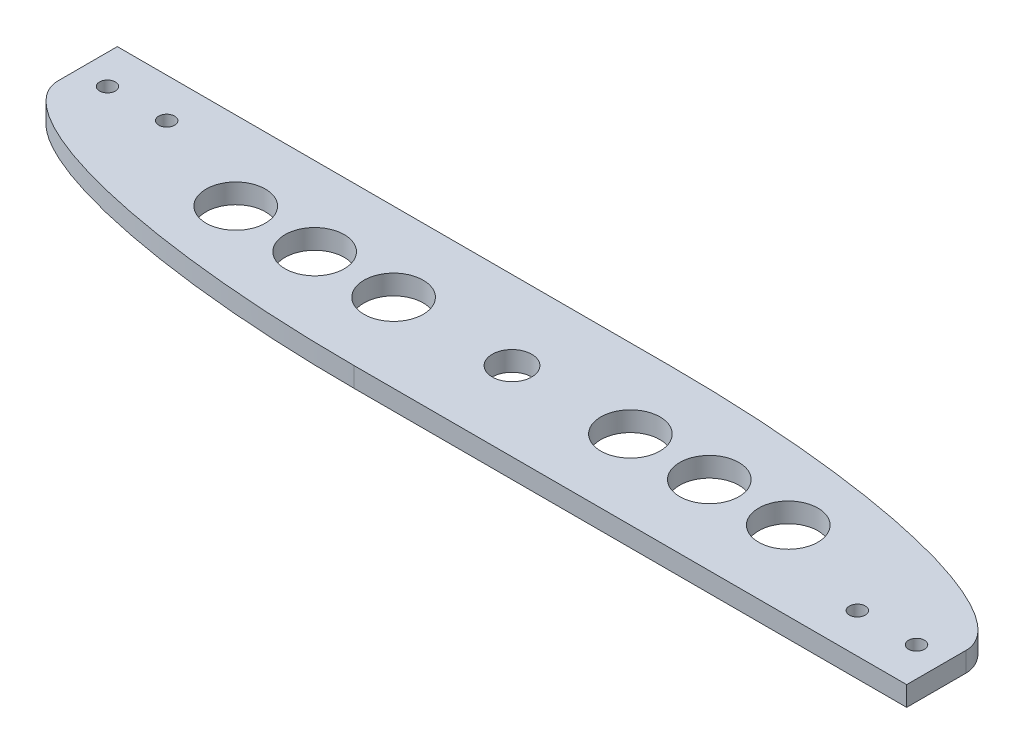
ISO-10303-21;
HEADER;
FILE_DESCRIPTION(('STEP AP214'),'2;1');
FILE_NAME('part.step','',(''),(''),'','','');
FILE_SCHEMA(('AUTOMOTIVE_DESIGN { 1 0 10303 214 1 1 1 1 }'));
ENDSEC;
DATA;
#1=APPLICATION_CONTEXT('core data for automotive mechanical design processes');
#2=APPLICATION_PROTOCOL_DEFINITION('international standard','automotive_design',2000,#1);
#3=PRODUCT_CONTEXT('',#1,'mechanical');
#4=PRODUCT('Part','Part','',(#3));
#5=PRODUCT_RELATED_PRODUCT_CATEGORY('part','',(#4));
#6=PRODUCT_DEFINITION_FORMATION('','',#4);
#7=PRODUCT_DEFINITION_CONTEXT('part definition',#1,'design');
#8=PRODUCT_DEFINITION('design','',#6,#7);
#9=PRODUCT_DEFINITION_SHAPE('','',#8);
#10=(LENGTH_UNIT() NAMED_UNIT(*) SI_UNIT(.MILLI.,.METRE.));
#11=(NAMED_UNIT(*) PLANE_ANGLE_UNIT() SI_UNIT($,.RADIAN.));
#12=(NAMED_UNIT(*) SI_UNIT($,.STERADIAN.) SOLID_ANGLE_UNIT());
#13=UNCERTAINTY_MEASURE_WITH_UNIT(LENGTH_MEASURE(1.E-05),#10,'distance_accuracy_value','');
#14=(GEOMETRIC_REPRESENTATION_CONTEXT(3) GLOBAL_UNCERTAINTY_ASSIGNED_CONTEXT((#13)) GLOBAL_UNIT_ASSIGNED_CONTEXT((#10,
#11,#12)) REPRESENTATION_CONTEXT('',''));
#15=CARTESIAN_POINT('',(0.,0.,0.));
#16=DIRECTION('',(0.,0.,1.));
#17=DIRECTION('',(1.,0.,0.));
#18=AXIS2_PLACEMENT_3D('',#15,#16,#17);
#19=CARTESIAN_POINT('',(0.,3.175,0.));
#20=DIRECTION('',(0.,-1.,0.));
#21=DIRECTION('',(0.,0.,-1.));
#22=AXIS2_PLACEMENT_3D('',#19,#20,#21);
#23=PLANE('',#22);
#24=DIRECTION('',(0.,0.,-1.));
#25=VECTOR('',#24,1.);
#26=CARTESIAN_POINT('',(152.4,3.175,25.4));
#27=LINE('',#26,#25);
#28=CARTESIAN_POINT('',(152.4,3.175,25.4));
#29=VERTEX_POINT('',#28);
#30=CARTESIAN_POINT('',(152.4,3.175,6.35));
#31=VERTEX_POINT('',#30);
#32=EDGE_CURVE('E116',#29,#31,#27,.T.);
#33=ORIENTED_EDGE('',*,*,#32,.T.);
#34=CARTESIAN_POINT('',(25.4,3.175,-25.4));
#35=CARTESIAN_POINT('',(152.4,3.175,-25.4));
#36=CARTESIAN_POINT('',(152.4,3.175,6.35));
#37=(BOUNDED_CURVE() B_SPLINE_CURVE(2,(#34,#35,#36),.UNSPECIFIED.,.F.,
.F.) B_SPLINE_CURVE_WITH_KNOTS((3,3),(0.,1.),
.UNSPECIFIED.) CURVE() GEOMETRIC_REPRESENTATION_ITEM() RATIONAL_B_SPLINE_CURVE((1.,
0.707106781186548,1.)) REPRESENTATION_ITEM(''));
#38=CARTESIAN_POINT('',(25.3999999999999,3.175,-25.4));
#39=VERTEX_POINT('',#38);
#40=EDGE_CURVE('E110',#31,#39,#37,.F.);
#41=ORIENTED_EDGE('',*,*,#40,.T.);
#42=DIRECTION('',(-1.,0.,0.));
#43=VECTOR('',#42,1.);
#44=CARTESIAN_POINT('',(-152.4,3.175,-25.4));
#45=LINE('',#44,#43);
#46=CARTESIAN_POINT('',(-152.4,3.175,-25.4));
#47=VERTEX_POINT('',#46);
#48=EDGE_CURVE('E104',#39,#47,#45,.T.);
#49=ORIENTED_EDGE('',*,*,#48,.T.);
#50=DIRECTION('',(0.,0.,1.));
#51=VECTOR('',#50,1.);
#52=CARTESIAN_POINT('',(-152.4,3.175,25.4));
#53=LINE('',#52,#51);
#54=CARTESIAN_POINT('',(-152.4,3.175,-6.35));
#55=VERTEX_POINT('',#54);
#56=EDGE_CURVE('E108',#47,#55,#53,.T.);
#57=ORIENTED_EDGE('',*,*,#56,.T.);
#58=CARTESIAN_POINT('',(-25.4,3.175,25.4));
#59=CARTESIAN_POINT('',(-152.4,3.175,25.4));
#60=CARTESIAN_POINT('',(-152.4,3.175,-6.35));
#61=(BOUNDED_CURVE() B_SPLINE_CURVE(2,(#58,#59,#60),.UNSPECIFIED.,.F.,
.F.) B_SPLINE_CURVE_WITH_KNOTS((3,3),(0.,1.),
.UNSPECIFIED.) CURVE() GEOMETRIC_REPRESENTATION_ITEM() RATIONAL_B_SPLINE_CURVE((1.,
0.707106781186548,1.)) REPRESENTATION_ITEM(''));
#62=CARTESIAN_POINT('',(-25.4000000000001,3.175,25.4));
#63=VERTEX_POINT('',#62);
#64=EDGE_CURVE('E66',#55,#63,#61,.F.);
#65=ORIENTED_EDGE('',*,*,#64,.T.);
#66=DIRECTION('',(1.,0.,0.));
#67=VECTOR('',#66,1.);
#68=CARTESIAN_POINT('',(-152.4,3.175,25.4));
#69=LINE('',#68,#67);
#70=EDGE_CURVE('E130',#63,#29,#69,.T.);
#71=ORIENTED_EDGE('',*,*,#70,.T.);
#72=EDGE_LOOP('',(#33,#41,#49,#57,#65,#71));
#73=FACE_BOUND('',#72,.T.);
#74=CARTESIAN_POINT('',(0.,3.175,0.));
#75=DIRECTION('',(0.,1.,0.));
#76=DIRECTION('',(0.,0.,1.));
#77=AXIS2_PLACEMENT_3D('',#74,#75,#76);
#78=CIRCLE('',#77,6.35);
#79=CARTESIAN_POINT('',(0.,3.175,6.35));
#80=VERTEX_POINT('',#79);
#81=EDGE_CURVE('E157',#80,#80,#78,.T.);
#82=ORIENTED_EDGE('',*,*,#81,.F.);
#83=EDGE_LOOP('',(#82));
#84=FACE_BOUND('',#83,.T.);
#85=CARTESIAN_POINT('',(-38.1,3.175,0.));
#86=DIRECTION('',(0.,1.,0.));
#87=DIRECTION('',(0.,0.,1.));
#88=AXIS2_PLACEMENT_3D('',#85,#86,#87);
#89=CIRCLE('',#88,9.525);
#90=CARTESIAN_POINT('',(-38.1,3.175,9.525));
#91=VERTEX_POINT('',#90);
#92=EDGE_CURVE('E195',#91,#91,#89,.T.);
#93=ORIENTED_EDGE('',*,*,#92,.F.);
#94=EDGE_LOOP('',(#93));
#95=FACE_BOUND('',#94,.T.);
#96=CARTESIAN_POINT('',(-63.5,3.175,0.));
#97=DIRECTION('',(0.,1.,0.));
#98=DIRECTION('',(0.,0.,1.));
#99=AXIS2_PLACEMENT_3D('',#96,#97,#98);
#100=CIRCLE('',#99,9.52500000000001);
#101=CARTESIAN_POINT('',(-63.5,3.175,9.52500000000001));
#102=VERTEX_POINT('',#101);
#103=EDGE_CURVE('E203',#102,#102,#100,.T.);
#104=ORIENTED_EDGE('',*,*,#103,.F.);
#105=EDGE_LOOP('',(#104));
#106=FACE_BOUND('',#105,.T.);
#107=CARTESIAN_POINT('',(-88.9,3.175,0.));
#108=DIRECTION('',(0.,1.,0.));
#109=DIRECTION('',(0.,0.,1.));
#110=AXIS2_PLACEMENT_3D('',#107,#108,#109);
#111=CIRCLE('',#110,9.52500000000001);
#112=CARTESIAN_POINT('',(-88.9,3.175,9.52500000000001));
#113=VERTEX_POINT('',#112);
#114=EDGE_CURVE('E211',#113,#113,#111,.T.);
#115=ORIENTED_EDGE('',*,*,#114,.F.);
#116=EDGE_LOOP('',(#115));
#117=FACE_BOUND('',#116,.T.);
#118=CARTESIAN_POINT('',(38.1,3.175,0.));
#119=DIRECTION('',(0.,1.,0.));
#120=DIRECTION('',(0.,0.,-1.));
#121=AXIS2_PLACEMENT_3D('',#118,#119,#120);
#122=CIRCLE('',#121,9.525);
#123=CARTESIAN_POINT('',(38.1,3.175,-9.525));
#124=VERTEX_POINT('',#123);
#125=EDGE_CURVE('E219',#124,#124,#122,.T.);
#126=ORIENTED_EDGE('',*,*,#125,.F.);
#127=EDGE_LOOP('',(#126));
#128=FACE_BOUND('',#127,.T.);
#129=CARTESIAN_POINT('',(63.5,3.175,0.));
#130=DIRECTION('',(0.,1.,0.));
#131=DIRECTION('',(0.,0.,-1.));
#132=AXIS2_PLACEMENT_3D('',#129,#130,#131);
#133=CIRCLE('',#132,9.52500000000001);
#134=CARTESIAN_POINT('',(63.5,3.175,-9.52500000000001));
#135=VERTEX_POINT('',#134);
#136=EDGE_CURVE('E227',#135,#135,#133,.T.);
#137=ORIENTED_EDGE('',*,*,#136,.F.);
#138=EDGE_LOOP('',(#137));
#139=FACE_BOUND('',#138,.T.);
#140=CARTESIAN_POINT('',(88.9,3.175,0.));
#141=DIRECTION('',(0.,1.,0.));
#142=DIRECTION('',(0.,0.,-1.));
#143=AXIS2_PLACEMENT_3D('',#140,#141,#142);
#144=CIRCLE('',#143,9.52500000000001);
#145=CARTESIAN_POINT('',(88.9,3.175,-9.52500000000001));
#146=VERTEX_POINT('',#145);
#147=EDGE_CURVE('E235',#146,#146,#144,.T.);
#148=ORIENTED_EDGE('',*,*,#147,.F.);
#149=EDGE_LOOP('',(#148));
#150=FACE_BOUND('',#149,.T.);
#151=CARTESIAN_POINT('',(142.875,3.175,12.7));
#152=DIRECTION('',(0.,1.,0.));
#153=DIRECTION('',(0.,0.,1.));
#154=AXIS2_PLACEMENT_3D('',#151,#152,#153);
#155=CIRCLE('',#154,2.55269999999998);
#156=CARTESIAN_POINT('',(142.875,3.175,15.2527));
#157=VERTEX_POINT('',#156);
#158=EDGE_CURVE('E243',#157,#157,#155,.T.);
#159=ORIENTED_EDGE('',*,*,#158,.F.);
#160=EDGE_LOOP('',(#159));
#161=FACE_BOUND('',#160,.T.);
#162=CARTESIAN_POINT('',(123.825,3.175,12.7));
#163=DIRECTION('',(0.,1.,0.));
#164=DIRECTION('',(0.,0.,1.));
#165=AXIS2_PLACEMENT_3D('',#162,#163,#164);
#166=CIRCLE('',#165,2.55269999999997);
#167=CARTESIAN_POINT('',(123.825,3.175,15.2527));
#168=VERTEX_POINT('',#167);
#169=EDGE_CURVE('E251',#168,#168,#166,.T.);
#170=ORIENTED_EDGE('',*,*,#169,.F.);
#171=EDGE_LOOP('',(#170));
#172=FACE_BOUND('',#171,.T.);
#173=CARTESIAN_POINT('',(-142.875,3.175,-12.7));
#174=DIRECTION('',(0.,1.,0.));
#175=DIRECTION('',(0.,0.,1.));
#176=AXIS2_PLACEMENT_3D('',#173,#174,#175);
#177=CIRCLE('',#176,2.55269999999998);
#178=CARTESIAN_POINT('',(-142.875,3.175,-10.1473));
#179=VERTEX_POINT('',#178);
#180=EDGE_CURVE('E259',#179,#179,#177,.T.);
#181=ORIENTED_EDGE('',*,*,#180,.F.);
#182=EDGE_LOOP('',(#181));
#183=FACE_BOUND('',#182,.T.);
#184=CARTESIAN_POINT('',(-123.825,3.175,-12.7));
#185=DIRECTION('',(0.,1.,0.));
#186=DIRECTION('',(0.,0.,1.));
#187=AXIS2_PLACEMENT_3D('',#184,#185,#186);
#188=CIRCLE('',#187,2.55270000000001);
#189=CARTESIAN_POINT('',(-123.825,3.175,-10.1473));
#190=VERTEX_POINT('',#189);
#191=EDGE_CURVE('E267',#190,#190,#188,.T.);
#192=ORIENTED_EDGE('',*,*,#191,.F.);
#193=EDGE_LOOP('',(#192));
#194=FACE_BOUND('',#193,.T.);
#195=ADVANCED_FACE('F44',(#73,#84,#95,#106,#117,#128,#139,#150,#161,#172,#183,#194),#23,.F.);
#196=CARTESIAN_POINT('',(0.,-3.175,0.));
#197=DIRECTION('',(0.,-1.,0.));
#198=DIRECTION('',(0.,0.,-1.));
#199=AXIS2_PLACEMENT_3D('',#196,#197,#198);
#200=PLANE('',#199);
#201=CARTESIAN_POINT('',(-142.875,-3.175,-12.7));
#202=DIRECTION('',(0.,1.,0.));
#203=DIRECTION('',(0.,0.,1.));
#204=AXIS2_PLACEMENT_3D('',#201,#202,#203);
#205=CIRCLE('',#204,2.55269999999998);
#206=CARTESIAN_POINT('',(-142.875,-3.175,-10.1473));
#207=VERTEX_POINT('',#206);
#208=EDGE_CURVE('E263',#207,#207,#205,.T.);
#209=ORIENTED_EDGE('',*,*,#208,.T.);
#210=EDGE_LOOP('',(#209));
#211=FACE_BOUND('',#210,.T.);
#212=CARTESIAN_POINT('',(142.875,-3.175,12.7));
#213=DIRECTION('',(0.,1.,0.));
#214=DIRECTION('',(0.,0.,1.));
#215=AXIS2_PLACEMENT_3D('',#212,#213,#214);
#216=CIRCLE('',#215,2.55269999999998);
#217=CARTESIAN_POINT('',(142.875,-3.175,15.2527));
#218=VERTEX_POINT('',#217);
#219=EDGE_CURVE('E247',#218,#218,#216,.T.);
#220=ORIENTED_EDGE('',*,*,#219,.T.);
#221=EDGE_LOOP('',(#220));
#222=FACE_BOUND('',#221,.T.);
#223=CARTESIAN_POINT('',(63.5,-3.175,0.));
#224=DIRECTION('',(0.,1.,0.));
#225=DIRECTION('',(0.,0.,-1.));
#226=AXIS2_PLACEMENT_3D('',#223,#224,#225);
#227=CIRCLE('',#226,9.52500000000001);
#228=CARTESIAN_POINT('',(63.5,-3.175,-9.52500000000001));
#229=VERTEX_POINT('',#228);
#230=EDGE_CURVE('E231',#229,#229,#227,.T.);
#231=ORIENTED_EDGE('',*,*,#230,.T.);
#232=EDGE_LOOP('',(#231));
#233=FACE_BOUND('',#232,.T.);
#234=CARTESIAN_POINT('',(-88.9,-3.175,0.));
#235=DIRECTION('',(0.,1.,0.));
#236=DIRECTION('',(0.,0.,1.));
#237=AXIS2_PLACEMENT_3D('',#234,#235,#236);
#238=CIRCLE('',#237,9.52500000000001);
#239=CARTESIAN_POINT('',(-88.9,-3.175,9.52500000000001));
#240=VERTEX_POINT('',#239);
#241=EDGE_CURVE('E215',#240,#240,#238,.T.);
#242=ORIENTED_EDGE('',*,*,#241,.T.);
#243=EDGE_LOOP('',(#242));
#244=FACE_BOUND('',#243,.T.);
#245=CARTESIAN_POINT('',(-38.1,-3.175,0.));
#246=DIRECTION('',(0.,1.,0.));
#247=DIRECTION('',(0.,0.,1.));
#248=AXIS2_PLACEMENT_3D('',#245,#246,#247);
#249=CIRCLE('',#248,9.525);
#250=CARTESIAN_POINT('',(-38.1,-3.175,9.525));
#251=VERTEX_POINT('',#250);
#252=EDGE_CURVE('E199',#251,#251,#249,.T.);
#253=ORIENTED_EDGE('',*,*,#252,.T.);
#254=EDGE_LOOP('',(#253));
#255=FACE_BOUND('',#254,.T.);
#256=DIRECTION('',(-1.,0.,0.));
#257=VECTOR('',#256,1.);
#258=CARTESIAN_POINT('',(-152.4,-3.175,-25.4));
#259=LINE('',#258,#257);
#260=CARTESIAN_POINT('',(25.3999999999999,-3.175,-25.4));
#261=VERTEX_POINT('',#260);
#262=CARTESIAN_POINT('',(-152.4,-3.175,-25.4));
#263=VERTEX_POINT('',#262);
#264=EDGE_CURVE('E122',#261,#263,#259,.T.);
#265=ORIENTED_EDGE('',*,*,#264,.F.);
#266=CARTESIAN_POINT('',(152.4,-3.175,6.35));
#267=CARTESIAN_POINT('',(152.4,-3.175,-25.4));
#268=CARTESIAN_POINT('',(25.4,-3.175,-25.4));
#269=(BOUNDED_CURVE() B_SPLINE_CURVE(2,(#266,#267,#268),.UNSPECIFIED.,.F.,
.F.) B_SPLINE_CURVE_WITH_KNOTS((3,3),(0.,1.),
.UNSPECIFIED.) CURVE() GEOMETRIC_REPRESENTATION_ITEM() RATIONAL_B_SPLINE_CURVE((1.,
0.707106781186548,1.)) REPRESENTATION_ITEM(''));
#270=CARTESIAN_POINT('',(152.4,-3.175,6.35));
#271=VERTEX_POINT('',#270);
#272=EDGE_CURVE('E183',#261,#271,#269,.F.);
#273=ORIENTED_EDGE('',*,*,#272,.T.);
#274=DIRECTION('',(0.,0.,-1.));
#275=VECTOR('',#274,1.);
#276=CARTESIAN_POINT('',(152.4,-3.175,25.4));
#277=LINE('',#276,#275);
#278=CARTESIAN_POINT('',(152.4,-3.175,25.4));
#279=VERTEX_POINT('',#278);
#280=EDGE_CURVE('E152',#279,#271,#277,.T.);
#281=ORIENTED_EDGE('',*,*,#280,.F.);
#282=DIRECTION('',(1.,0.,0.));
#283=VECTOR('',#282,1.);
#284=CARTESIAN_POINT('',(-152.4,-3.175,25.4));
#285=LINE('',#284,#283);
#286=CARTESIAN_POINT('',(-25.4000000000001,-3.175,25.4));
#287=VERTEX_POINT('',#286);
#288=EDGE_CURVE('E162',#287,#279,#285,.T.);
#289=ORIENTED_EDGE('',*,*,#288,.F.);
#290=CARTESIAN_POINT('',(-152.4,-3.175,-6.35));
#291=CARTESIAN_POINT('',(-152.4,-3.175,25.4));
#292=CARTESIAN_POINT('',(-25.4,-3.175,25.4));
#293=(BOUNDED_CURVE() B_SPLINE_CURVE(2,(#290,#291,#292),.UNSPECIFIED.,.F.,
.F.) B_SPLINE_CURVE_WITH_KNOTS((3,3),(0.,1.),
.UNSPECIFIED.) CURVE() GEOMETRIC_REPRESENTATION_ITEM() RATIONAL_B_SPLINE_CURVE((1.,
0.707106781186548,1.)) REPRESENTATION_ITEM(''));
#294=CARTESIAN_POINT('',(-152.4,-3.175,-6.35));
#295=VERTEX_POINT('',#294);
#296=EDGE_CURVE('E178',#287,#295,#293,.F.);
#297=ORIENTED_EDGE('',*,*,#296,.T.);
#298=DIRECTION('',(0.,0.,1.));
#299=VECTOR('',#298,1.);
#300=CARTESIAN_POINT('',(-152.4,-3.175,25.4));
#301=LINE('',#300,#299);
#302=EDGE_CURVE('E166',#263,#295,#301,.T.);
#303=ORIENTED_EDGE('',*,*,#302,.F.);
#304=EDGE_LOOP('',(#265,#273,#281,#289,#297,#303));
#305=FACE_BOUND('',#304,.T.);
#306=CARTESIAN_POINT('',(0.,-3.175,0.));
#307=DIRECTION('',(0.,1.,0.));
#308=DIRECTION('',(0.,0.,1.));
#309=AXIS2_PLACEMENT_3D('',#306,#307,#308);
#310=CIRCLE('',#309,6.35);
#311=CARTESIAN_POINT('',(0.,-3.175,6.35));
#312=VERTEX_POINT('',#311);
#313=EDGE_CURVE('E191',#312,#312,#310,.T.);
#314=ORIENTED_EDGE('',*,*,#313,.T.);
#315=EDGE_LOOP('',(#314));
#316=FACE_BOUND('',#315,.T.);
#317=CARTESIAN_POINT('',(-63.5,-3.175,0.));
#318=DIRECTION('',(0.,1.,0.));
#319=DIRECTION('',(0.,0.,1.));
#320=AXIS2_PLACEMENT_3D('',#317,#318,#319);
#321=CIRCLE('',#320,9.52500000000001);
#322=CARTESIAN_POINT('',(-63.5,-3.175,9.52500000000001));
#323=VERTEX_POINT('',#322);
#324=EDGE_CURVE('E207',#323,#323,#321,.T.);
#325=ORIENTED_EDGE('',*,*,#324,.T.);
#326=EDGE_LOOP('',(#325));
#327=FACE_BOUND('',#326,.T.);
#328=CARTESIAN_POINT('',(38.1,-3.175,0.));
#329=DIRECTION('',(0.,1.,0.));
#330=DIRECTION('',(0.,0.,-1.));
#331=AXIS2_PLACEMENT_3D('',#328,#329,#330);
#332=CIRCLE('',#331,9.525);
#333=CARTESIAN_POINT('',(38.1,-3.175,-9.525));
#334=VERTEX_POINT('',#333);
#335=EDGE_CURVE('E223',#334,#334,#332,.T.);
#336=ORIENTED_EDGE('',*,*,#335,.T.);
#337=EDGE_LOOP('',(#336));
#338=FACE_BOUND('',#337,.T.);
#339=CARTESIAN_POINT('',(88.9,-3.175,0.));
#340=DIRECTION('',(0.,1.,0.));
#341=DIRECTION('',(0.,0.,-1.));
#342=AXIS2_PLACEMENT_3D('',#339,#340,#341);
#343=CIRCLE('',#342,9.52500000000001);
#344=CARTESIAN_POINT('',(88.9,-3.175,-9.52500000000001));
#345=VERTEX_POINT('',#344);
#346=EDGE_CURVE('E239',#345,#345,#343,.T.);
#347=ORIENTED_EDGE('',*,*,#346,.T.);
#348=EDGE_LOOP('',(#347));
#349=FACE_BOUND('',#348,.T.);
#350=CARTESIAN_POINT('',(123.825,-3.175,12.7));
#351=DIRECTION('',(0.,1.,0.));
#352=DIRECTION('',(0.,0.,1.));
#353=AXIS2_PLACEMENT_3D('',#350,#351,#352);
#354=CIRCLE('',#353,2.55269999999997);
#355=CARTESIAN_POINT('',(123.825,-3.175,15.2527));
#356=VERTEX_POINT('',#355);
#357=EDGE_CURVE('E255',#356,#356,#354,.T.);
#358=ORIENTED_EDGE('',*,*,#357,.T.);
#359=EDGE_LOOP('',(#358));
#360=FACE_BOUND('',#359,.T.);
#361=CARTESIAN_POINT('',(-123.825,-3.175,-12.7));
#362=DIRECTION('',(0.,1.,0.));
#363=DIRECTION('',(0.,0.,1.));
#364=AXIS2_PLACEMENT_3D('',#361,#362,#363);
#365=CIRCLE('',#364,2.55270000000001);
#366=CARTESIAN_POINT('',(-123.825,-3.175,-10.1473));
#367=VERTEX_POINT('',#366);
#368=EDGE_CURVE('E271',#367,#367,#365,.T.);
#369=ORIENTED_EDGE('',*,*,#368,.T.);
#370=EDGE_LOOP('',(#369));
#371=FACE_BOUND('',#370,.T.);
#372=ADVANCED_FACE('F180',(#211,#222,#233,#244,#255,#305,#316,#327,#338,#349,#360,#371),#200,.T.);
#373=CARTESIAN_POINT('',(152.4,3.175,25.4));
#374=DIRECTION('',(-1.,0.,0.));
#375=DIRECTION('',(0.,0.,1.));
#376=AXIS2_PLACEMENT_3D('',#373,#374,#375);
#377=PLANE('',#376);
#378=ORIENTED_EDGE('',*,*,#280,.T.);
#379=CARTESIAN_POINT('',(152.4,3.4925,6.35));
#380=CARTESIAN_POINT('',(152.4,1.16416666666667,6.35));
#381=CARTESIAN_POINT('',(152.4,-1.16416666666667,6.35));
#382=CARTESIAN_POINT('',(152.4,-3.4925,6.35));
#383=(BOUNDED_CURVE() B_SPLINE_CURVE(3,(#379,#380,#381,#382),.UNSPECIFIED.,.F.,
.F.) B_SPLINE_CURVE_WITH_KNOTS((4,4),(-0.0003175,0.0066675),
.UNSPECIFIED.) CURVE() GEOMETRIC_REPRESENTATION_ITEM() RATIONAL_B_SPLINE_CURVE((1.,1.,1.,1.)) REPRESENTATION_ITEM(''));
#384=EDGE_CURVE('E286',#271,#31,#383,.F.);
#385=ORIENTED_EDGE('',*,*,#384,.T.);
#386=ORIENTED_EDGE('',*,*,#32,.F.);
#387=DIRECTION('',(0.,-1.,0.));
#388=VECTOR('',#387,1.);
#389=CARTESIAN_POINT('',(152.4,3.175,25.4));
#390=LINE('',#389,#388);
#391=EDGE_CURVE('E126',#29,#279,#390,.T.);
#392=ORIENTED_EDGE('',*,*,#391,.T.);
#393=EDGE_LOOP('',(#378,#385,#386,#392));
#394=FACE_BOUND('',#393,.T.);
#395=ADVANCED_FACE('F287',(#394),#377,.F.);
#396=CARTESIAN_POINT('',(-152.4,3.175,-25.4));
#397=DIRECTION('',(0.,0.,1.));
#398=DIRECTION('',(1.,0.,0.));
#399=AXIS2_PLACEMENT_3D('',#396,#397,#398);
#400=PLANE('',#399);
#401=ORIENTED_EDGE('',*,*,#48,.F.);
#402=CARTESIAN_POINT('',(25.4,-3.4925,-25.4));
#403=CARTESIAN_POINT('',(25.4,-1.16416666666667,-25.4));
#404=CARTESIAN_POINT('',(25.4,1.16416666666667,-25.4));
#405=CARTESIAN_POINT('',(25.4,3.4925,-25.4));
#406=(BOUNDED_CURVE() B_SPLINE_CURVE(3,(#402,#403,#404,#405),.UNSPECIFIED.,.F.,
.F.) B_SPLINE_CURVE_WITH_KNOTS((4,4),(-0.0003175,0.0066675),
.UNSPECIFIED.) CURVE() GEOMETRIC_REPRESENTATION_ITEM() RATIONAL_B_SPLINE_CURVE((1.,1.,1.,1.)) REPRESENTATION_ITEM(''));
#407=EDGE_CURVE('E125',#39,#261,#406,.F.);
#408=ORIENTED_EDGE('',*,*,#407,.T.);
#409=ORIENTED_EDGE('',*,*,#264,.T.);
#410=DIRECTION('',(0.,-1.,0.));
#411=VECTOR('',#410,1.);
#412=CARTESIAN_POINT('',(-152.4,3.175,-25.4));
#413=LINE('',#412,#411);
#414=EDGE_CURVE('E119',#47,#263,#413,.T.);
#415=ORIENTED_EDGE('',*,*,#414,.F.);
#416=EDGE_LOOP('',(#401,#408,#409,#415));
#417=FACE_BOUND('',#416,.T.);
#418=ADVANCED_FACE('F120',(#417),#400,.F.);
#419=CARTESIAN_POINT('',(-152.4,3.175,25.4));
#420=DIRECTION('',(1.,0.,0.));
#421=DIRECTION('',(0.,0.,-1.));
#422=AXIS2_PLACEMENT_3D('',#419,#420,#421);
#423=PLANE('',#422);
#424=ORIENTED_EDGE('',*,*,#302,.T.);
#425=CARTESIAN_POINT('',(-152.4,3.4925,-6.35));
#426=CARTESIAN_POINT('',(-152.4,1.16416666666667,-6.35));
#427=CARTESIAN_POINT('',(-152.4,-1.16416666666667,-6.35));
#428=CARTESIAN_POINT('',(-152.4,-3.4925,-6.35));
#429=(BOUNDED_CURVE() B_SPLINE_CURVE(3,(#425,#426,#427,#428),.UNSPECIFIED.,.F.,
.F.) B_SPLINE_CURVE_WITH_KNOTS((4,4),(-0.0003175,0.0066675),
.UNSPECIFIED.) CURVE() GEOMETRIC_REPRESENTATION_ITEM() RATIONAL_B_SPLINE_CURVE((1.,1.,1.,1.)) REPRESENTATION_ITEM(''));
#430=EDGE_CURVE('E12',#295,#55,#429,.F.);
#431=ORIENTED_EDGE('',*,*,#430,.T.);
#432=ORIENTED_EDGE('',*,*,#56,.F.);
#433=ORIENTED_EDGE('',*,*,#414,.T.);
#434=EDGE_LOOP('',(#424,#431,#432,#433));
#435=FACE_BOUND('',#434,.T.);
#436=ADVANCED_FACE('F128',(#435),#423,.F.);
#437=CARTESIAN_POINT('',(-152.4,3.175,25.4));
#438=DIRECTION('',(0.,0.,-1.));
#439=DIRECTION('',(-1.,0.,0.));
#440=AXIS2_PLACEMENT_3D('',#437,#438,#439);
#441=PLANE('',#440);
#442=ORIENTED_EDGE('',*,*,#70,.F.);
#443=CARTESIAN_POINT('',(-25.4,-3.4925,25.4));
#444=CARTESIAN_POINT('',(-25.4,-1.16416666666667,25.4));
#445=CARTESIAN_POINT('',(-25.4,1.16416666666667,25.4));
#446=CARTESIAN_POINT('',(-25.4,3.4925,25.4));
#447=(BOUNDED_CURVE() B_SPLINE_CURVE(3,(#443,#444,#445,#446),.UNSPECIFIED.,.F.,
.F.) B_SPLINE_CURVE_WITH_KNOTS((4,4),(-0.0003175,0.0066675),
.UNSPECIFIED.) CURVE() GEOMETRIC_REPRESENTATION_ITEM() RATIONAL_B_SPLINE_CURVE((1.,1.,1.,1.)) REPRESENTATION_ITEM(''));
#448=EDGE_CURVE('E59',#63,#287,#447,.F.);
#449=ORIENTED_EDGE('',*,*,#448,.T.);
#450=ORIENTED_EDGE('',*,*,#288,.T.);
#451=ORIENTED_EDGE('',*,*,#391,.F.);
#452=EDGE_LOOP('',(#442,#449,#450,#451));
#453=FACE_BOUND('',#452,.T.);
#454=ADVANCED_FACE('F397',(#453),#441,.F.);
#455=CARTESIAN_POINT('',(0.,3.175,0.));
#456=DIRECTION('',(0.,-1.,0.));
#457=DIRECTION('',(0.,0.,-1.));
#458=AXIS2_PLACEMENT_3D('',#455,#456,#457);
#459=CYLINDRICAL_SURFACE('',#458,6.35);
#460=ORIENTED_EDGE('',*,*,#81,.T.);
#461=EDGE_LOOP('',(#460));
#462=FACE_BOUND('',#461,.T.);
#463=ORIENTED_EDGE('',*,*,#313,.F.);
#464=EDGE_LOOP('',(#463));
#465=FACE_BOUND('',#464,.T.);
#466=ADVANCED_FACE('F375',(#462,#465),#459,.F.);
#467=CARTESIAN_POINT('',(-38.1,3.175,0.));
#468=DIRECTION('',(0.,-1.,0.));
#469=DIRECTION('',(0.,0.,-1.));
#470=AXIS2_PLACEMENT_3D('',#467,#468,#469);
#471=CYLINDRICAL_SURFACE('',#470,9.525);
#472=ORIENTED_EDGE('',*,*,#92,.T.);
#473=EDGE_LOOP('',(#472));
#474=FACE_BOUND('',#473,.T.);
#475=ORIENTED_EDGE('',*,*,#252,.F.);
#476=EDGE_LOOP('',(#475));
#477=FACE_BOUND('',#476,.T.);
#478=ADVANCED_FACE('F524',(#474,#477),#471,.F.);
#479=CARTESIAN_POINT('',(-63.5,3.175,0.));
#480=DIRECTION('',(0.,-1.,0.));
#481=DIRECTION('',(0.,0.,-1.));
#482=AXIS2_PLACEMENT_3D('',#479,#480,#481);
#483=CYLINDRICAL_SURFACE('',#482,9.52500000000001);
#484=ORIENTED_EDGE('',*,*,#103,.T.);
#485=EDGE_LOOP('',(#484));
#486=FACE_BOUND('',#485,.T.);
#487=ORIENTED_EDGE('',*,*,#324,.F.);
#488=EDGE_LOOP('',(#487));
#489=FACE_BOUND('',#488,.T.);
#490=ADVANCED_FACE('F514',(#486,#489),#483,.F.);
#491=CARTESIAN_POINT('',(-88.9,3.175,0.));
#492=DIRECTION('',(0.,-1.,0.));
#493=DIRECTION('',(0.,0.,-1.));
#494=AXIS2_PLACEMENT_3D('',#491,#492,#493);
#495=CYLINDRICAL_SURFACE('',#494,9.52500000000001);
#496=ORIENTED_EDGE('',*,*,#114,.T.);
#497=EDGE_LOOP('',(#496));
#498=FACE_BOUND('',#497,.T.);
#499=ORIENTED_EDGE('',*,*,#241,.F.);
#500=EDGE_LOOP('',(#499));
#501=FACE_BOUND('',#500,.T.);
#502=ADVANCED_FACE('F504',(#498,#501),#495,.F.);
#503=CARTESIAN_POINT('',(38.1,3.175,0.));
#504=DIRECTION('',(0.,-1.,0.));
#505=DIRECTION('',(0.,0.,-1.));
#506=AXIS2_PLACEMENT_3D('',#503,#504,#505);
#507=CYLINDRICAL_SURFACE('',#506,9.525);
#508=ORIENTED_EDGE('',*,*,#125,.T.);
#509=EDGE_LOOP('',(#508));
#510=FACE_BOUND('',#509,.T.);
#511=ORIENTED_EDGE('',*,*,#335,.F.);
#512=EDGE_LOOP('',(#511));
#513=FACE_BOUND('',#512,.T.);
#514=ADVANCED_FACE('F494',(#510,#513),#507,.F.);
#515=CARTESIAN_POINT('',(63.5,3.175,0.));
#516=DIRECTION('',(0.,-1.,0.));
#517=DIRECTION('',(0.,0.,-1.));
#518=AXIS2_PLACEMENT_3D('',#515,#516,#517);
#519=CYLINDRICAL_SURFACE('',#518,9.52500000000001);
#520=ORIENTED_EDGE('',*,*,#136,.T.);
#521=EDGE_LOOP('',(#520));
#522=FACE_BOUND('',#521,.T.);
#523=ORIENTED_EDGE('',*,*,#230,.F.);
#524=EDGE_LOOP('',(#523));
#525=FACE_BOUND('',#524,.T.);
#526=ADVANCED_FACE('F484',(#522,#525),#519,.F.);
#527=CARTESIAN_POINT('',(88.9,3.175,0.));
#528=DIRECTION('',(0.,-1.,0.));
#529=DIRECTION('',(0.,0.,-1.));
#530=AXIS2_PLACEMENT_3D('',#527,#528,#529);
#531=CYLINDRICAL_SURFACE('',#530,9.52500000000001);
#532=ORIENTED_EDGE('',*,*,#147,.T.);
#533=EDGE_LOOP('',(#532));
#534=FACE_BOUND('',#533,.T.);
#535=ORIENTED_EDGE('',*,*,#346,.F.);
#536=EDGE_LOOP('',(#535));
#537=FACE_BOUND('',#536,.T.);
#538=ADVANCED_FACE('F474',(#534,#537),#531,.F.);
#539=CARTESIAN_POINT('',(142.875,3.175,12.7));
#540=DIRECTION('',(0.,-1.,0.));
#541=DIRECTION('',(0.,0.,-1.));
#542=AXIS2_PLACEMENT_3D('',#539,#540,#541);
#543=CYLINDRICAL_SURFACE('',#542,2.55269999999998);
#544=ORIENTED_EDGE('',*,*,#158,.T.);
#545=EDGE_LOOP('',(#544));
#546=FACE_BOUND('',#545,.T.);
#547=ORIENTED_EDGE('',*,*,#219,.F.);
#548=EDGE_LOOP('',(#547));
#549=FACE_BOUND('',#548,.T.);
#550=ADVANCED_FACE('F464',(#546,#549),#543,.F.);
#551=CARTESIAN_POINT('',(123.825,3.175,12.7));
#552=DIRECTION('',(0.,-1.,0.));
#553=DIRECTION('',(0.,0.,-1.));
#554=AXIS2_PLACEMENT_3D('',#551,#552,#553);
#555=CYLINDRICAL_SURFACE('',#554,2.55269999999997);
#556=ORIENTED_EDGE('',*,*,#169,.T.);
#557=EDGE_LOOP('',(#556));
#558=FACE_BOUND('',#557,.T.);
#559=ORIENTED_EDGE('',*,*,#357,.F.);
#560=EDGE_LOOP('',(#559));
#561=FACE_BOUND('',#560,.T.);
#562=ADVANCED_FACE('F454',(#558,#561),#555,.F.);
#563=CARTESIAN_POINT('',(-142.875,3.175,-12.7));
#564=DIRECTION('',(0.,-1.,0.));
#565=DIRECTION('',(0.,0.,-1.));
#566=AXIS2_PLACEMENT_3D('',#563,#564,#565);
#567=CYLINDRICAL_SURFACE('',#566,2.55269999999998);
#568=ORIENTED_EDGE('',*,*,#180,.T.);
#569=EDGE_LOOP('',(#568));
#570=FACE_BOUND('',#569,.T.);
#571=ORIENTED_EDGE('',*,*,#208,.F.);
#572=EDGE_LOOP('',(#571));
#573=FACE_BOUND('',#572,.T.);
#574=ADVANCED_FACE('F443',(#570,#573),#567,.F.);
#575=CARTESIAN_POINT('',(-123.825,3.175,-12.7));
#576=DIRECTION('',(0.,-1.,0.));
#577=DIRECTION('',(0.,0.,-1.));
#578=AXIS2_PLACEMENT_3D('',#575,#576,#577);
#579=CYLINDRICAL_SURFACE('',#578,2.55270000000001);
#580=ORIENTED_EDGE('',*,*,#191,.T.);
#581=EDGE_LOOP('',(#580));
#582=FACE_BOUND('',#581,.T.);
#583=ORIENTED_EDGE('',*,*,#368,.F.);
#584=EDGE_LOOP('',(#583));
#585=FACE_BOUND('',#584,.T.);
#586=ADVANCED_FACE('F313',(#582,#585),#579,.F.);
#587=CARTESIAN_POINT('',(25.4,3.4925,-25.4));
#588=CARTESIAN_POINT('',(25.4,1.16416666666667,-25.4));
#589=CARTESIAN_POINT('',(25.4,-1.16416666666667,-25.4));
#590=CARTESIAN_POINT('',(25.4,-3.4925,-25.4));
#591=CARTESIAN_POINT('',(152.4,3.4925,-25.4));
#592=CARTESIAN_POINT('',(152.4,1.16416666666667,-25.4));
#593=CARTESIAN_POINT('',(152.4,-1.16416666666667,-25.4));
#594=CARTESIAN_POINT('',(152.4,-3.4925,-25.4));
#595=CARTESIAN_POINT('',(152.4,3.4925,6.35));
#596=CARTESIAN_POINT('',(152.4,1.16416666666667,6.35));
#597=CARTESIAN_POINT('',(152.4,-1.16416666666667,6.35));
#598=CARTESIAN_POINT('',(152.4,-3.4925,6.35));
#599=(BOUNDED_SURFACE() B_SPLINE_SURFACE(2,3,((#587,#588,#589,#590),(#591,#592,#593,#594),(#595,
#596,#597,#598)),.UNSPECIFIED.,.F.,.F.,.F.) B_SPLINE_SURFACE_WITH_KNOTS((3,3),(4,4),(0.,1.),
(-0.0003175,0.0066675),
.UNSPECIFIED.) GEOMETRIC_REPRESENTATION_ITEM() RATIONAL_B_SPLINE_SURFACE(((1.,1.,1.,1.),
(0.707106781186548,0.707106781186548,0.707106781186548,0.707106781186548),(1.,1.,1.,1.))) REPRESENTATION_ITEM('') SURFACE());
#600=ORIENTED_EDGE('',*,*,#40,.F.);
#601=ORIENTED_EDGE('',*,*,#384,.F.);
#602=ORIENTED_EDGE('',*,*,#272,.F.);
#603=ORIENTED_EDGE('',*,*,#407,.F.);
#604=EDGE_LOOP('',(#600,#601,#602,#603));
#605=FACE_BOUND('',#604,.T.);
#606=ADVANCED_FACE('F292',(#605),#599,.T.);
#607=CARTESIAN_POINT('',(-25.4,3.4925,25.4));
#608=CARTESIAN_POINT('',(-25.4,1.16416666666667,25.4));
#609=CARTESIAN_POINT('',(-25.4,-1.16416666666667,25.4));
#610=CARTESIAN_POINT('',(-25.4,-3.4925,25.4));
#611=CARTESIAN_POINT('',(-152.4,3.4925,25.4));
#612=CARTESIAN_POINT('',(-152.4,1.16416666666667,25.4));
#613=CARTESIAN_POINT('',(-152.4,-1.16416666666667,25.4));
#614=CARTESIAN_POINT('',(-152.4,-3.4925,25.4));
#615=CARTESIAN_POINT('',(-152.4,3.4925,-6.35));
#616=CARTESIAN_POINT('',(-152.4,1.16416666666667,-6.35));
#617=CARTESIAN_POINT('',(-152.4,-1.16416666666667,-6.35));
#618=CARTESIAN_POINT('',(-152.4,-3.4925,-6.35));
#619=(BOUNDED_SURFACE() B_SPLINE_SURFACE(2,3,((#607,#608,#609,#610),(#611,#612,#613,#614),(#615,
#616,#617,#618)),.UNSPECIFIED.,.F.,.F.,.F.) B_SPLINE_SURFACE_WITH_KNOTS((3,3),(4,4),(0.,1.),
(-0.0003175,0.0066675),
.UNSPECIFIED.) GEOMETRIC_REPRESENTATION_ITEM() RATIONAL_B_SPLINE_SURFACE(((1.,1.,1.,1.),
(0.707106781186548,0.707106781186548,0.707106781186548,0.707106781186548),(1.,1.,1.,1.))) REPRESENTATION_ITEM('') SURFACE());
#620=ORIENTED_EDGE('',*,*,#64,.F.);
#621=ORIENTED_EDGE('',*,*,#430,.F.);
#622=ORIENTED_EDGE('',*,*,#296,.F.);
#623=ORIENTED_EDGE('',*,*,#448,.F.);
#624=EDGE_LOOP('',(#620,#621,#622,#623));
#625=FACE_BOUND('',#624,.T.);
#626=ADVANCED_FACE('F47',(#625),#619,.T.);
#627=CLOSED_SHELL('',(#195,#372,#395,#418,#436,#454,#466,#478,#490,#502,#514,#526,#538,#550,
#562,#574,#586,#606,#626));
#628=MANIFOLD_SOLID_BREP('B2',#627);
#629=ADVANCED_BREP_SHAPE_REPRESENTATION('',(#18,#628),#14);
#630=SHAPE_DEFINITION_REPRESENTATION(#9,#629);
ENDSEC;
END-ISO-10303-21;
